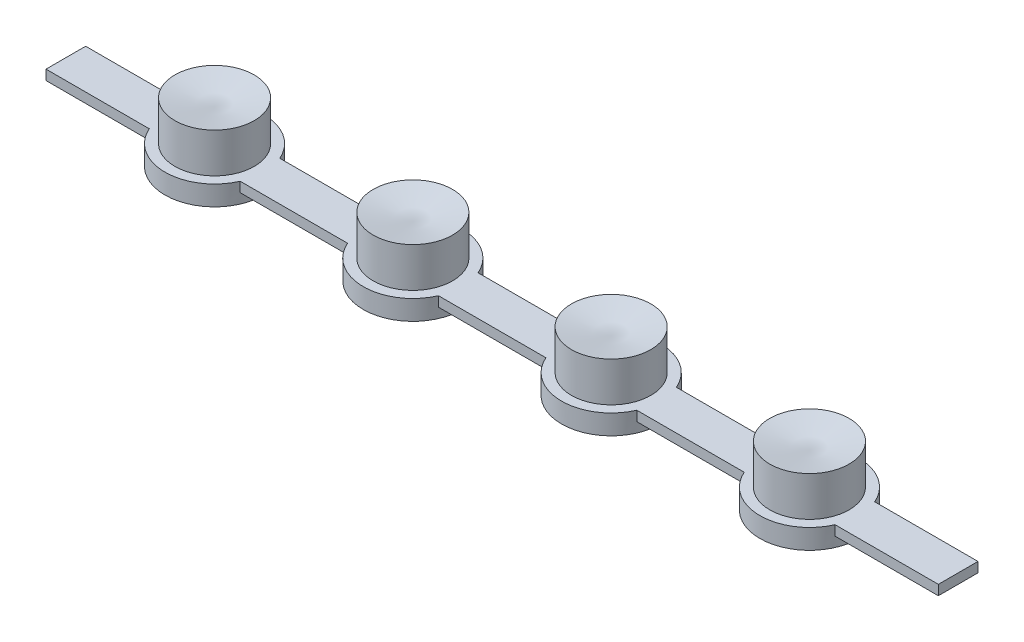
ISO-10303-21;
HEADER;
FILE_DESCRIPTION(('STEP AP214'),'2;1');
FILE_NAME('part.step','',(''),(''),'','','');
FILE_SCHEMA(('AUTOMOTIVE_DESIGN { 1 0 10303 214 1 1 1 1 }'));
ENDSEC;
DATA;
#1=APPLICATION_CONTEXT('core data for automotive mechanical design processes');
#2=APPLICATION_PROTOCOL_DEFINITION('international standard','automotive_design',2000,#1);
#3=PRODUCT_CONTEXT('',#1,'mechanical');
#4=PRODUCT('Part','Part','',(#3));
#5=PRODUCT_RELATED_PRODUCT_CATEGORY('part','',(#4));
#6=PRODUCT_DEFINITION_FORMATION('','',#4);
#7=PRODUCT_DEFINITION_CONTEXT('part definition',#1,'design');
#8=PRODUCT_DEFINITION('design','',#6,#7);
#9=PRODUCT_DEFINITION_SHAPE('','',#8);
#10=(LENGTH_UNIT() NAMED_UNIT(*) SI_UNIT(.MILLI.,.METRE.));
#11=(NAMED_UNIT(*) PLANE_ANGLE_UNIT() SI_UNIT($,.RADIAN.));
#12=(NAMED_UNIT(*) SI_UNIT($,.STERADIAN.) SOLID_ANGLE_UNIT());
#13=UNCERTAINTY_MEASURE_WITH_UNIT(LENGTH_MEASURE(1.E-05),#10,'distance_accuracy_value','');
#14=(GEOMETRIC_REPRESENTATION_CONTEXT(3) GLOBAL_UNCERTAINTY_ASSIGNED_CONTEXT((#13)) GLOBAL_UNIT_ASSIGNED_CONTEXT((#10,
#11,#12)) REPRESENTATION_CONTEXT('',''));
#15=CARTESIAN_POINT('',(0.,0.,0.));
#16=DIRECTION('',(0.,0.,1.));
#17=DIRECTION('',(1.,0.,0.));
#18=AXIS2_PLACEMENT_3D('',#15,#16,#17);
#19=CARTESIAN_POINT('',(0.,0.5,0.));
#20=DIRECTION('',(0.,-1.,0.));
#21=DIRECTION('',(0.,0.,-1.));
#22=AXIS2_PLACEMENT_3D('',#19,#20,#21);
#23=PLANE('',#22);
#24=DIRECTION('',(-1.,0.,0.));
#25=VECTOR('',#24,1.);
#26=CARTESIAN_POINT('',(-7.5,0.5,-0.999999999999999));
#27=LINE('',#26,#25);
#28=CARTESIAN_POINT('',(27.7087121525221,0.5,-0.999999999999999));
#29=VERTEX_POINT('',#28);
#30=CARTESIAN_POINT('',(22.2912878474779,0.5,-0.999999999999999));
#31=VERTEX_POINT('',#30);
#32=EDGE_CURVE('E272',#29,#31,#27,.T.);
#33=ORIENTED_EDGE('',*,*,#32,.F.);
#34=CARTESIAN_POINT('',(30.,0.5,0.));
#35=DIRECTION('',(0.,-1.,0.));
#36=DIRECTION('',(0.,0.,-1.));
#37=AXIS2_PLACEMENT_3D('',#34,#35,#36);
#38=CIRCLE('',#37,2.5);
#39=CARTESIAN_POINT('',(27.7087121525221,0.5,1.));
#40=VERTEX_POINT('',#39);
#41=EDGE_CURVE('E195',#29,#40,#38,.F.);
#42=ORIENTED_EDGE('',*,*,#41,.T.);
#43=DIRECTION('',(1.,0.,0.));
#44=VECTOR('',#43,1.);
#45=CARTESIAN_POINT('',(-7.5,0.5,1.));
#46=LINE('',#45,#44);
#47=CARTESIAN_POINT('',(22.2912878474779,0.5,1.));
#48=VERTEX_POINT('',#47);
#49=EDGE_CURVE('E466',#48,#40,#46,.T.);
#50=ORIENTED_EDGE('',*,*,#49,.F.);
#51=CARTESIAN_POINT('',(20.,0.5,0.));
#52=DIRECTION('',(0.,-1.,0.));
#53=DIRECTION('',(0.,0.,-1.));
#54=AXIS2_PLACEMENT_3D('',#51,#52,#53);
#55=CIRCLE('',#54,2.5);
#56=EDGE_CURVE('E225',#48,#31,#55,.F.);
#57=ORIENTED_EDGE('',*,*,#56,.T.);
#58=EDGE_LOOP('',(#33,#42,#50,#57));
#59=FACE_BOUND('',#58,.T.);
#60=ADVANCED_FACE('F33',(#59),#23,.T.);
#61=CARTESIAN_POINT('',(-7.5,0.5,1.));
#62=DIRECTION('',(0.,0.,1.));
#63=DIRECTION('',(1.,0.,0.));
#64=AXIS2_PLACEMENT_3D('',#61,#62,#63);
#65=PLANE('',#64);
#66=ORIENTED_EDGE('',*,*,#49,.T.);
#67=DIRECTION('',(0.,-1.,0.));
#68=VECTOR('',#67,1.);
#69=CARTESIAN_POINT('',(27.7087121525221,1.,1.));
#70=LINE('',#69,#68);
#71=CARTESIAN_POINT('',(27.7087121525221,1.,1.));
#72=VERTEX_POINT('',#71);
#73=EDGE_CURVE('E205',#40,#72,#70,.F.);
#74=ORIENTED_EDGE('',*,*,#73,.T.);
#75=DIRECTION('',(1.,0.,0.));
#76=VECTOR('',#75,1.);
#77=CARTESIAN_POINT('',(-7.5,1.,1.));
#78=LINE('',#77,#76);
#79=CARTESIAN_POINT('',(22.2912878474779,1.,1.));
#80=VERTEX_POINT('',#79);
#81=EDGE_CURVE('E436',#80,#72,#78,.T.);
#82=ORIENTED_EDGE('',*,*,#81,.F.);
#83=DIRECTION('',(0.,-1.,0.));
#84=VECTOR('',#83,1.);
#85=CARTESIAN_POINT('',(22.2912878474779,1.,1.));
#86=LINE('',#85,#84);
#87=EDGE_CURVE('E228',#80,#48,#86,.T.);
#88=ORIENTED_EDGE('',*,*,#87,.T.);
#89=EDGE_LOOP('',(#66,#74,#82,#88));
#90=FACE_BOUND('',#89,.T.);
#91=ADVANCED_FACE('F360',(#90),#65,.T.);
#92=CARTESIAN_POINT('',(-7.5,0.5,-0.999999999999999));
#93=DIRECTION('',(0.,0.,-1.));
#94=DIRECTION('',(-1.,0.,0.));
#95=AXIS2_PLACEMENT_3D('',#92,#93,#94);
#96=PLANE('',#95);
#97=DIRECTION('',(-1.,0.,0.));
#98=VECTOR('',#97,1.);
#99=CARTESIAN_POINT('',(-7.5,1.,-0.999999999999999));
#100=LINE('',#99,#98);
#101=CARTESIAN_POINT('',(27.7087121525221,1.,-0.999999999999999));
#102=VERTEX_POINT('',#101);
#103=CARTESIAN_POINT('',(22.2912878474779,1.,-0.999999999999999));
#104=VERTEX_POINT('',#103);
#105=EDGE_CURVE('E288',#102,#104,#100,.T.);
#106=ORIENTED_EDGE('',*,*,#105,.F.);
#107=DIRECTION('',(0.,-1.,0.));
#108=VECTOR('',#107,1.);
#109=CARTESIAN_POINT('',(27.7087121525221,1.,-0.999999999999999));
#110=LINE('',#109,#108);
#111=EDGE_CURVE('E191',#102,#29,#110,.T.);
#112=ORIENTED_EDGE('',*,*,#111,.T.);
#113=ORIENTED_EDGE('',*,*,#32,.T.);
#114=DIRECTION('',(0.,-1.,0.));
#115=VECTOR('',#114,1.);
#116=CARTESIAN_POINT('',(22.2912878474779,1.,-0.999999999999999));
#117=LINE('',#116,#115);
#118=EDGE_CURVE('E232',#31,#104,#117,.F.);
#119=ORIENTED_EDGE('',*,*,#118,.T.);
#120=EDGE_LOOP('',(#106,#112,#113,#119));
#121=FACE_BOUND('',#120,.T.);
#122=ADVANCED_FACE('F368',(#121),#96,.T.);
#123=CARTESIAN_POINT('',(17.7087121525221,1.,-0.999999999999999));
#124=VERTEX_POINT('',#123);
#125=CARTESIAN_POINT('',(12.2912878474779,1.,-0.999999999999999));
#126=VERTEX_POINT('',#125);
#127=EDGE_CURVE('E454',#124,#126,#100,.T.);
#128=ORIENTED_EDGE('',*,*,#127,.F.);
#129=DIRECTION('',(0.,-1.,0.));
#130=VECTOR('',#129,1.);
#131=CARTESIAN_POINT('',(17.7087121525221,1.,-0.999999999999999));
#132=LINE('',#131,#130);
#133=CARTESIAN_POINT('',(17.7087121525221,0.5,-0.999999999999999));
#134=VERTEX_POINT('',#133);
#135=EDGE_CURVE('E238',#124,#134,#132,.T.);
#136=ORIENTED_EDGE('',*,*,#135,.T.);
#137=CARTESIAN_POINT('',(12.2912878474779,0.5,-0.999999999999999));
#138=VERTEX_POINT('',#137);
#139=EDGE_CURVE('E419',#134,#138,#27,.T.);
#140=ORIENTED_EDGE('',*,*,#139,.T.);
#141=DIRECTION('',(0.,-1.,0.));
#142=VECTOR('',#141,1.);
#143=CARTESIAN_POINT('',(12.2912878474779,1.,-0.999999999999999));
#144=LINE('',#143,#142);
#145=EDGE_CURVE('E333',#138,#126,#144,.F.);
#146=ORIENTED_EDGE('',*,*,#145,.T.);
#147=EDGE_LOOP('',(#128,#136,#140,#146));
#148=FACE_BOUND('',#147,.T.);
#149=ADVANCED_FACE('F679',(#148),#96,.T.);
#150=CARTESIAN_POINT('',(12.2912878474779,0.5,1.));
#151=VERTEX_POINT('',#150);
#152=CARTESIAN_POINT('',(17.7087121525221,0.5,1.));
#153=VERTEX_POINT('',#152);
#154=EDGE_CURVE('E464',#151,#153,#46,.T.);
#155=ORIENTED_EDGE('',*,*,#154,.T.);
#156=DIRECTION('',(0.,-1.,0.));
#157=VECTOR('',#156,1.);
#158=CARTESIAN_POINT('',(17.7087121525221,1.,1.));
#159=LINE('',#158,#157);
#160=CARTESIAN_POINT('',(17.7087121525221,1.,1.));
#161=VERTEX_POINT('',#160);
#162=EDGE_CURVE('E235',#153,#161,#159,.F.);
#163=ORIENTED_EDGE('',*,*,#162,.T.);
#164=CARTESIAN_POINT('',(12.2912878474779,1.,1.));
#165=VERTEX_POINT('',#164);
#166=EDGE_CURVE('E435',#165,#161,#78,.T.);
#167=ORIENTED_EDGE('',*,*,#166,.F.);
#168=DIRECTION('',(0.,-1.,0.));
#169=VECTOR('',#168,1.);
#170=CARTESIAN_POINT('',(12.2912878474779,1.,1.));
#171=LINE('',#170,#169);
#172=EDGE_CURVE('E260',#165,#151,#171,.T.);
#173=ORIENTED_EDGE('',*,*,#172,.T.);
#174=EDGE_LOOP('',(#155,#163,#167,#173));
#175=FACE_BOUND('',#174,.T.);
#176=ADVANCED_FACE('F377',(#175),#65,.T.);
#177=ORIENTED_EDGE('',*,*,#139,.F.);
#178=EDGE_CURVE('E229',#134,#153,#55,.F.);
#179=ORIENTED_EDGE('',*,*,#178,.T.);
#180=ORIENTED_EDGE('',*,*,#154,.F.);
#181=CARTESIAN_POINT('',(10.,0.5,0.));
#182=DIRECTION('',(0.,-1.,0.));
#183=DIRECTION('',(0.,0.,-1.));
#184=AXIS2_PLACEMENT_3D('',#181,#182,#183);
#185=CIRCLE('',#184,2.5);
#186=EDGE_CURVE('E257',#151,#138,#185,.F.);
#187=ORIENTED_EDGE('',*,*,#186,.T.);
#188=EDGE_LOOP('',(#177,#179,#180,#187));
#189=FACE_BOUND('',#188,.T.);
#190=ADVANCED_FACE('F363',(#189),#23,.T.);
#191=CARTESIAN_POINT('',(7.70871215252208,0.5,-0.999999999999999));
#192=VERTEX_POINT('',#191);
#193=CARTESIAN_POINT('',(2.29128784747792,0.5,-0.999999999999999));
#194=VERTEX_POINT('',#193);
#195=EDGE_CURVE('E413',#192,#194,#27,.T.);
#196=ORIENTED_EDGE('',*,*,#195,.F.);
#197=CARTESIAN_POINT('',(7.70871215252208,0.5,1.));
#198=VERTEX_POINT('',#197);
#199=EDGE_CURVE('E250',#192,#198,#185,.F.);
#200=ORIENTED_EDGE('',*,*,#199,.T.);
#201=CARTESIAN_POINT('',(2.29128784747792,0.5,1.));
#202=VERTEX_POINT('',#201);
#203=EDGE_CURVE('E280',#202,#198,#46,.T.);
#204=ORIENTED_EDGE('',*,*,#203,.F.);
#205=CARTESIAN_POINT('',(0.,0.5,0.));
#206=DIRECTION('',(0.,-1.,0.));
#207=DIRECTION('',(0.,0.,-1.));
#208=AXIS2_PLACEMENT_3D('',#205,#206,#207);
#209=CIRCLE('',#208,2.5);
#210=EDGE_CURVE('E329',#194,#202,#209,.T.);
#211=ORIENTED_EDGE('',*,*,#210,.F.);
#212=EDGE_LOOP('',(#196,#200,#204,#211));
#213=FACE_BOUND('',#212,.T.);
#214=ADVANCED_FACE('F376',(#213),#23,.T.);
#215=ORIENTED_EDGE('',*,*,#203,.T.);
#216=DIRECTION('',(0.,-1.,0.));
#217=VECTOR('',#216,1.);
#218=CARTESIAN_POINT('',(7.70871215252208,1.,1.));
#219=LINE('',#218,#217);
#220=CARTESIAN_POINT('',(7.70871215252208,1.,1.));
#221=VERTEX_POINT('',#220);
#222=EDGE_CURVE('E256',#198,#221,#219,.F.);
#223=ORIENTED_EDGE('',*,*,#222,.T.);
#224=CARTESIAN_POINT('',(2.29128784747792,1.,1.));
#225=VERTEX_POINT('',#224);
#226=EDGE_CURVE('E292',#225,#221,#78,.T.);
#227=ORIENTED_EDGE('',*,*,#226,.F.);
#228=DIRECTION('',(0.,-1.,0.));
#229=VECTOR('',#228,1.);
#230=CARTESIAN_POINT('',(2.29128784747792,1.,1.));
#231=LINE('',#230,#229);
#232=EDGE_CURVE('E308',#202,#225,#231,.F.);
#233=ORIENTED_EDGE('',*,*,#232,.F.);
#234=EDGE_LOOP('',(#215,#223,#227,#233));
#235=FACE_BOUND('',#234,.T.);
#236=ADVANCED_FACE('F405',(#235),#65,.T.);
#237=CARTESIAN_POINT('',(7.70871215252208,1.,-0.999999999999999));
#238=VERTEX_POINT('',#237);
#239=CARTESIAN_POINT('',(2.29128784747792,1.,-0.999999999999999));
#240=VERTEX_POINT('',#239);
#241=EDGE_CURVE('E455',#238,#240,#100,.T.);
#242=ORIENTED_EDGE('',*,*,#241,.F.);
#243=DIRECTION('',(0.,-1.,0.));
#244=VECTOR('',#243,1.);
#245=CARTESIAN_POINT('',(7.70871215252208,1.,-0.999999999999999));
#246=LINE('',#245,#244);
#247=EDGE_CURVE('E330',#238,#192,#246,.T.);
#248=ORIENTED_EDGE('',*,*,#247,.T.);
#249=ORIENTED_EDGE('',*,*,#195,.T.);
#250=DIRECTION('',(0.,-1.,0.));
#251=VECTOR('',#250,1.);
#252=CARTESIAN_POINT('',(2.29128784747792,1.,-0.999999999999999));
#253=LINE('',#252,#251);
#254=EDGE_CURVE('E305',#240,#194,#253,.T.);
#255=ORIENTED_EDGE('',*,*,#254,.F.);
#256=EDGE_LOOP('',(#242,#248,#249,#255));
#257=FACE_BOUND('',#256,.T.);
#258=ADVANCED_FACE('F391',(#257),#96,.T.);
#259=CARTESIAN_POINT('',(0.,3.,0.));
#260=DIRECTION('',(0.,-1.,0.));
#261=DIRECTION('',(0.,0.,-1.));
#262=AXIS2_PLACEMENT_3D('',#259,#260,#261);
#263=CYLINDRICAL_SURFACE('',#262,2.);
#264=CARTESIAN_POINT('',(0.,1.,0.));
#265=DIRECTION('',(0.,1.,0.));
#266=DIRECTION('',(0.,0.,1.));
#267=AXIS2_PLACEMENT_3D('',#264,#265,#266);
#268=CIRCLE('',#267,2.);
#269=CARTESIAN_POINT('',(0.,1.,2.));
#270=VERTEX_POINT('',#269);
#271=EDGE_CURVE('E324',#270,#270,#268,.T.);
#272=ORIENTED_EDGE('',*,*,#271,.T.);
#273=EDGE_LOOP('',(#272));
#274=FACE_BOUND('',#273,.T.);
#275=CARTESIAN_POINT('',(0.,3.,0.));
#276=DIRECTION('',(0.,1.,0.));
#277=DIRECTION('',(0.,0.,1.));
#278=AXIS2_PLACEMENT_3D('',#275,#276,#277);
#279=CIRCLE('',#278,2.);
#280=CARTESIAN_POINT('',(0.,3.,2.));
#281=VERTEX_POINT('',#280);
#282=EDGE_CURVE('E320',#281,#281,#279,.T.);
#283=ORIENTED_EDGE('',*,*,#282,.F.);
#284=EDGE_LOOP('',(#283));
#285=FACE_BOUND('',#284,.T.);
#286=ADVANCED_FACE('F35',(#274,#285),#263,.T.);
#287=CARTESIAN_POINT('',(0.,3.,0.));
#288=DIRECTION('',(0.,1.,0.));
#289=DIRECTION('',(0.,0.,1.));
#290=AXIS2_PLACEMENT_3D('',#287,#288,#289);
#291=CONICAL_SURFACE('',#290,2.,1.37340076694502);
#292=CARTESIAN_POINT('',(0.,2.6,0.));
#293=VERTEX_POINT('',#292);
#294=VERTEX_LOOP('',#293);
#295=FACE_BOUND('',#294,.T.);
#296=ORIENTED_EDGE('',*,*,#282,.T.);
#297=EDGE_LOOP('',(#296));
#298=FACE_BOUND('',#297,.T.);
#299=ADVANCED_FACE('F499',(#295,#298),#291,.F.);
#300=CARTESIAN_POINT('',(0.,1.,0.));
#301=DIRECTION('',(0.,-1.,0.));
#302=DIRECTION('',(0.,0.,-1.));
#303=AXIS2_PLACEMENT_3D('',#300,#301,#302);
#304=CYLINDRICAL_SURFACE('',#303,2.5);
#305=ORIENTED_EDGE('',*,*,#210,.T.);
#306=ORIENTED_EDGE('',*,*,#232,.T.);
#307=CARTESIAN_POINT('',(0.,1.,0.));
#308=DIRECTION('',(0.,1.,0.));
#309=DIRECTION('',(0.,0.,1.));
#310=AXIS2_PLACEMENT_3D('',#307,#308,#309);
#311=CIRCLE('',#310,2.5);
#312=CARTESIAN_POINT('',(-2.29128784747792,1.,1.));
#313=VERTEX_POINT('',#312);
#314=EDGE_CURVE('E315',#313,#225,#311,.T.);
#315=ORIENTED_EDGE('',*,*,#314,.F.);
#316=DIRECTION('',(0.,-1.,0.));
#317=VECTOR('',#316,1.);
#318=CARTESIAN_POINT('',(-2.29128784747792,1.,1.));
#319=LINE('',#318,#317);
#320=CARTESIAN_POINT('',(-2.29128784747792,0.5,1.));
#321=VERTEX_POINT('',#320);
#322=EDGE_CURVE('E311',#313,#321,#319,.T.);
#323=ORIENTED_EDGE('',*,*,#322,.T.);
#324=CARTESIAN_POINT('',(-2.29128784747792,0.5,-0.999999999999999));
#325=VERTEX_POINT('',#324);
#326=EDGE_CURVE('E323',#321,#325,#209,.T.);
#327=ORIENTED_EDGE('',*,*,#326,.T.);
#328=DIRECTION('',(0.,-1.,0.));
#329=VECTOR('',#328,1.);
#330=CARTESIAN_POINT('',(-2.29128784747792,1.,-0.999999999999999));
#331=LINE('',#330,#329);
#332=CARTESIAN_POINT('',(-2.29128784747792,1.,-0.999999999999999));
#333=VERTEX_POINT('',#332);
#334=EDGE_CURVE('E296',#325,#333,#331,.F.);
#335=ORIENTED_EDGE('',*,*,#334,.T.);
#336=EDGE_CURVE('E317',#240,#333,#311,.T.);
#337=ORIENTED_EDGE('',*,*,#336,.F.);
#338=ORIENTED_EDGE('',*,*,#254,.T.);
#339=EDGE_LOOP('',(#305,#306,#315,#323,#327,#335,#337,#338));
#340=FACE_BOUND('',#339,.T.);
#341=CARTESIAN_POINT('',(0.,0.,0.));
#342=DIRECTION('',(0.,1.,0.));
#343=DIRECTION('',(0.,0.,1.));
#344=AXIS2_PLACEMENT_3D('',#341,#342,#343);
#345=CIRCLE('',#344,2.5);
#346=CARTESIAN_POINT('',(0.,0.,2.5));
#347=VERTEX_POINT('',#346);
#348=EDGE_CURVE('E314',#347,#347,#345,.T.);
#349=ORIENTED_EDGE('',*,*,#348,.T.);
#350=EDGE_LOOP('',(#349));
#351=FACE_BOUND('',#350,.T.);
#352=ADVANCED_FACE('F428',(#340,#351),#304,.T.);
#353=CARTESIAN_POINT('',(0.,0.,0.));
#354=DIRECTION('',(0.,1.,0.));
#355=DIRECTION('',(0.,0.,1.));
#356=AXIS2_PLACEMENT_3D('',#353,#354,#355);
#357=PLANE('',#356);
#358=ORIENTED_EDGE('',*,*,#348,.F.);
#359=EDGE_LOOP('',(#358));
#360=FACE_BOUND('',#359,.T.);
#361=ADVANCED_FACE('F392',(#360),#357,.F.);
#362=CARTESIAN_POINT('',(-7.5,0.5,1.));
#363=DIRECTION('',(-1.,0.,0.));
#364=DIRECTION('',(0.,0.,1.));
#365=AXIS2_PLACEMENT_3D('',#362,#363,#364);
#366=PLANE('',#365);
#367=DIRECTION('',(0.,0.,1.));
#368=VECTOR('',#367,1.);
#369=CARTESIAN_POINT('',(-7.5,1.,1.));
#370=LINE('',#369,#368);
#371=CARTESIAN_POINT('',(-7.5,1.,-0.999999999999999));
#372=VERTEX_POINT('',#371);
#373=CARTESIAN_POINT('',(-7.5,1.,1.));
#374=VERTEX_POINT('',#373);
#375=EDGE_CURVE('E287',#372,#374,#370,.T.);
#376=ORIENTED_EDGE('',*,*,#375,.F.);
#377=DIRECTION('',(0.,1.,0.));
#378=VECTOR('',#377,1.);
#379=CARTESIAN_POINT('',(-7.5,0.5,-0.999999999999999));
#380=LINE('',#379,#378);
#381=CARTESIAN_POINT('',(-7.5,0.5,-0.999999999999999));
#382=VERTEX_POINT('',#381);
#383=EDGE_CURVE('E299',#382,#372,#380,.T.);
#384=ORIENTED_EDGE('',*,*,#383,.F.);
#385=DIRECTION('',(0.,0.,1.));
#386=VECTOR('',#385,1.);
#387=CARTESIAN_POINT('',(-7.5,0.5,1.));
#388=LINE('',#387,#386);
#389=CARTESIAN_POINT('',(-7.5,0.5,1.));
#390=VERTEX_POINT('',#389);
#391=EDGE_CURVE('E271',#382,#390,#388,.T.);
#392=ORIENTED_EDGE('',*,*,#391,.T.);
#393=DIRECTION('',(0.,1.,0.));
#394=VECTOR('',#393,1.);
#395=CARTESIAN_POINT('',(-7.5,0.5,1.));
#396=LINE('',#395,#394);
#397=EDGE_CURVE('E297',#390,#374,#396,.T.);
#398=ORIENTED_EDGE('',*,*,#397,.T.);
#399=EDGE_LOOP('',(#376,#384,#392,#398));
#400=FACE_BOUND('',#399,.T.);
#401=ADVANCED_FACE('F381',(#400),#366,.T.);
#402=ORIENTED_EDGE('',*,*,#326,.F.);
#403=EDGE_CURVE('E276',#390,#321,#46,.T.);
#404=ORIENTED_EDGE('',*,*,#403,.F.);
#405=ORIENTED_EDGE('',*,*,#391,.F.);
#406=EDGE_CURVE('E267',#325,#382,#27,.T.);
#407=ORIENTED_EDGE('',*,*,#406,.F.);
#408=EDGE_LOOP('',(#402,#404,#405,#407));
#409=FACE_BOUND('',#408,.T.);
#410=ADVANCED_FACE('F364',(#409),#23,.T.);
#411=ORIENTED_EDGE('',*,*,#334,.F.);
#412=ORIENTED_EDGE('',*,*,#406,.T.);
#413=ORIENTED_EDGE('',*,*,#383,.T.);
#414=EDGE_CURVE('E283',#333,#372,#100,.T.);
#415=ORIENTED_EDGE('',*,*,#414,.F.);
#416=EDGE_LOOP('',(#411,#412,#413,#415));
#417=FACE_BOUND('',#416,.T.);
#418=ADVANCED_FACE('F380',(#417),#96,.T.);
#419=ORIENTED_EDGE('',*,*,#322,.F.);
#420=EDGE_CURVE('E55',#374,#313,#78,.T.);
#421=ORIENTED_EDGE('',*,*,#420,.F.);
#422=ORIENTED_EDGE('',*,*,#397,.F.);
#423=ORIENTED_EDGE('',*,*,#403,.T.);
#424=EDGE_LOOP('',(#419,#421,#422,#423));
#425=FACE_BOUND('',#424,.T.);
#426=ADVANCED_FACE('F372',(#425),#65,.T.);
#427=CARTESIAN_POINT('',(10.,3.,0.));
#428=DIRECTION('',(0.,-1.,0.));
#429=DIRECTION('',(0.,0.,-1.));
#430=AXIS2_PLACEMENT_3D('',#427,#428,#429);
#431=CYLINDRICAL_SURFACE('',#430,2.);
#432=CARTESIAN_POINT('',(10.,1.,0.));
#433=DIRECTION('',(0.,1.,0.));
#434=DIRECTION('',(0.,0.,1.));
#435=AXIS2_PLACEMENT_3D('',#432,#433,#434);
#436=CIRCLE('',#435,2.);
#437=CARTESIAN_POINT('',(10.,1.,2.));
#438=VERTEX_POINT('',#437);
#439=EDGE_CURVE('E251',#438,#438,#436,.T.);
#440=ORIENTED_EDGE('',*,*,#439,.T.);
#441=EDGE_LOOP('',(#440));
#442=FACE_BOUND('',#441,.T.);
#443=CARTESIAN_POINT('',(10.,3.,0.));
#444=DIRECTION('',(0.,1.,0.));
#445=DIRECTION('',(0.,0.,1.));
#446=AXIS2_PLACEMENT_3D('',#443,#444,#445);
#447=CIRCLE('',#446,2.);
#448=CARTESIAN_POINT('',(10.,3.,2.));
#449=VERTEX_POINT('',#448);
#450=EDGE_CURVE('E247',#449,#449,#447,.T.);
#451=ORIENTED_EDGE('',*,*,#450,.F.);
#452=EDGE_LOOP('',(#451));
#453=FACE_BOUND('',#452,.T.);
#454=ADVANCED_FACE('F543',(#442,#453),#431,.T.);
#455=CARTESIAN_POINT('',(10.,3.,0.));
#456=DIRECTION('',(0.,1.,0.));
#457=DIRECTION('',(0.,0.,1.));
#458=AXIS2_PLACEMENT_3D('',#455,#456,#457);
#459=CONICAL_SURFACE('',#458,2.,1.37340076694502);
#460=CARTESIAN_POINT('',(10.,2.6,0.));
#461=VERTEX_POINT('',#460);
#462=VERTEX_LOOP('',#461);
#463=FACE_BOUND('',#462,.T.);
#464=ORIENTED_EDGE('',*,*,#450,.T.);
#465=EDGE_LOOP('',(#464));
#466=FACE_BOUND('',#465,.T.);
#467=ADVANCED_FACE('F552',(#463,#466),#459,.F.);
#468=CARTESIAN_POINT('',(10.,1.,0.));
#469=DIRECTION('',(0.,-1.,0.));
#470=DIRECTION('',(0.,0.,-1.));
#471=AXIS2_PLACEMENT_3D('',#468,#469,#470);
#472=CYLINDRICAL_SURFACE('',#471,2.5);
#473=ORIENTED_EDGE('',*,*,#172,.F.);
#474=CARTESIAN_POINT('',(10.,1.,0.));
#475=DIRECTION('',(0.,1.,0.));
#476=DIRECTION('',(0.,0.,1.));
#477=AXIS2_PLACEMENT_3D('',#474,#475,#476);
#478=CIRCLE('',#477,2.5);
#479=EDGE_CURVE('E242',#221,#165,#478,.T.);
#480=ORIENTED_EDGE('',*,*,#479,.F.);
#481=ORIENTED_EDGE('',*,*,#222,.F.);
#482=ORIENTED_EDGE('',*,*,#199,.F.);
#483=ORIENTED_EDGE('',*,*,#247,.F.);
#484=EDGE_CURVE('E48',#126,#238,#478,.T.);
#485=ORIENTED_EDGE('',*,*,#484,.F.);
#486=ORIENTED_EDGE('',*,*,#145,.F.);
#487=ORIENTED_EDGE('',*,*,#186,.F.);
#488=EDGE_LOOP('',(#473,#480,#481,#482,#483,#485,#486,#487));
#489=FACE_BOUND('',#488,.T.);
#490=CARTESIAN_POINT('',(10.,0.,0.));
#491=DIRECTION('',(0.,1.,0.));
#492=DIRECTION('',(0.,0.,1.));
#493=AXIS2_PLACEMENT_3D('',#490,#491,#492);
#494=CIRCLE('',#493,2.5);
#495=CARTESIAN_POINT('',(10.,0.,2.5));
#496=VERTEX_POINT('',#495);
#497=EDGE_CURVE('E241',#496,#496,#494,.T.);
#498=ORIENTED_EDGE('',*,*,#497,.T.);
#499=EDGE_LOOP('',(#498));
#500=FACE_BOUND('',#499,.T.);
#501=ADVANCED_FACE('F461',(#489,#500),#472,.T.);
#502=CARTESIAN_POINT('',(10.,0.,0.));
#503=DIRECTION('',(0.,1.,0.));
#504=DIRECTION('',(0.,0.,1.));
#505=AXIS2_PLACEMENT_3D('',#502,#503,#504);
#506=PLANE('',#505);
#507=ORIENTED_EDGE('',*,*,#497,.F.);
#508=EDGE_LOOP('',(#507));
#509=FACE_BOUND('',#508,.T.);
#510=ADVANCED_FACE('F344',(#509),#506,.F.);
#511=CARTESIAN_POINT('',(20.,3.,0.));
#512=DIRECTION('',(0.,-1.,0.));
#513=DIRECTION('',(0.,0.,-1.));
#514=AXIS2_PLACEMENT_3D('',#511,#512,#513);
#515=CYLINDRICAL_SURFACE('',#514,2.);
#516=CARTESIAN_POINT('',(20.,1.,0.));
#517=DIRECTION('',(0.,1.,0.));
#518=DIRECTION('',(0.,0.,1.));
#519=AXIS2_PLACEMENT_3D('',#516,#517,#518);
#520=CIRCLE('',#519,2.);
#521=CARTESIAN_POINT('',(20.,1.,2.));
#522=VERTEX_POINT('',#521);
#523=EDGE_CURVE('E41',#522,#522,#520,.F.);
#524=ORIENTED_EDGE('',*,*,#523,.F.);
#525=EDGE_LOOP('',(#524));
#526=FACE_BOUND('',#525,.T.);
#527=CARTESIAN_POINT('',(20.,3.,0.));
#528=DIRECTION('',(0.,1.,0.));
#529=DIRECTION('',(0.,0.,1.));
#530=AXIS2_PLACEMENT_3D('',#527,#528,#529);
#531=CIRCLE('',#530,2.);
#532=CARTESIAN_POINT('',(20.,3.,2.));
#533=VERTEX_POINT('',#532);
#534=EDGE_CURVE('E222',#533,#533,#531,.T.);
#535=ORIENTED_EDGE('',*,*,#534,.F.);
#536=EDGE_LOOP('',(#535));
#537=FACE_BOUND('',#536,.T.);
#538=ADVANCED_FACE('F340',(#526,#537),#515,.T.);
#539=CARTESIAN_POINT('',(20.,3.,0.));
#540=DIRECTION('',(0.,1.,0.));
#541=DIRECTION('',(0.,0.,1.));
#542=AXIS2_PLACEMENT_3D('',#539,#540,#541);
#543=CONICAL_SURFACE('',#542,2.,1.37340076694502);
#544=CARTESIAN_POINT('',(20.,2.6,0.));
#545=VERTEX_POINT('',#544);
#546=VERTEX_LOOP('',#545);
#547=FACE_BOUND('',#546,.T.);
#548=ORIENTED_EDGE('',*,*,#534,.T.);
#549=EDGE_LOOP('',(#548));
#550=FACE_BOUND('',#549,.T.);
#551=ADVANCED_FACE('F343',(#547,#550),#543,.F.);
#552=CARTESIAN_POINT('',(20.,1.,0.));
#553=DIRECTION('',(0.,-1.,0.));
#554=DIRECTION('',(0.,0.,-1.));
#555=AXIS2_PLACEMENT_3D('',#552,#553,#554);
#556=CYLINDRICAL_SURFACE('',#555,2.5);
#557=ORIENTED_EDGE('',*,*,#135,.F.);
#558=CARTESIAN_POINT('',(20.,1.,0.));
#559=DIRECTION('',(0.,1.,0.));
#560=DIRECTION('',(0.,0.,1.));
#561=AXIS2_PLACEMENT_3D('',#558,#559,#560);
#562=CIRCLE('',#561,2.5);
#563=EDGE_CURVE('E219',#104,#124,#562,.T.);
#564=ORIENTED_EDGE('',*,*,#563,.F.);
#565=ORIENTED_EDGE('',*,*,#118,.F.);
#566=ORIENTED_EDGE('',*,*,#56,.F.);
#567=ORIENTED_EDGE('',*,*,#87,.F.);
#568=EDGE_CURVE('E216',#161,#80,#562,.T.);
#569=ORIENTED_EDGE('',*,*,#568,.F.);
#570=ORIENTED_EDGE('',*,*,#162,.F.);
#571=ORIENTED_EDGE('',*,*,#178,.F.);
#572=EDGE_LOOP('',(#557,#564,#565,#566,#567,#569,#570,#571));
#573=FACE_BOUND('',#572,.T.);
#574=CARTESIAN_POINT('',(20.,0.,0.));
#575=DIRECTION('',(0.,1.,0.));
#576=DIRECTION('',(0.,0.,1.));
#577=AXIS2_PLACEMENT_3D('',#574,#575,#576);
#578=CIRCLE('',#577,2.5);
#579=CARTESIAN_POINT('',(20.,0.,2.5));
#580=VERTEX_POINT('',#579);
#581=EDGE_CURVE('E215',#580,#580,#578,.T.);
#582=ORIENTED_EDGE('',*,*,#581,.T.);
#583=EDGE_LOOP('',(#582));
#584=FACE_BOUND('',#583,.T.);
#585=ADVANCED_FACE('F349',(#573,#584),#556,.T.);
#586=CARTESIAN_POINT('',(20.,0.,0.));
#587=DIRECTION('',(0.,1.,0.));
#588=DIRECTION('',(0.,0.,1.));
#589=AXIS2_PLACEMENT_3D('',#586,#587,#588);
#590=PLANE('',#589);
#591=ORIENTED_EDGE('',*,*,#581,.F.);
#592=EDGE_LOOP('',(#591));
#593=FACE_BOUND('',#592,.T.);
#594=ADVANCED_FACE('F355',(#593),#590,.F.);
#595=CARTESIAN_POINT('',(30.,3.,0.));
#596=DIRECTION('',(0.,-1.,0.));
#597=DIRECTION('',(0.,0.,-1.));
#598=AXIS2_PLACEMENT_3D('',#595,#596,#597);
#599=CYLINDRICAL_SURFACE('',#598,2.);
#600=CARTESIAN_POINT('',(30.,1.,0.));
#601=DIRECTION('',(0.,1.,0.));
#602=DIRECTION('',(0.,0.,1.));
#603=AXIS2_PLACEMENT_3D('',#600,#601,#602);
#604=CIRCLE('',#603,2.);
#605=CARTESIAN_POINT('',(30.,1.,2.));
#606=VERTEX_POINT('',#605);
#607=EDGE_CURVE('E11',#606,#606,#604,.F.);
#608=ORIENTED_EDGE('',*,*,#607,.F.);
#609=EDGE_LOOP('',(#608));
#610=FACE_BOUND('',#609,.T.);
#611=CARTESIAN_POINT('',(30.,3.,0.));
#612=DIRECTION('',(0.,1.,0.));
#613=DIRECTION('',(0.,0.,1.));
#614=AXIS2_PLACEMENT_3D('',#611,#612,#613);
#615=CIRCLE('',#614,2.);
#616=CARTESIAN_POINT('',(30.,3.,2.));
#617=VERTEX_POINT('',#616);
#618=EDGE_CURVE('E189',#617,#617,#615,.T.);
#619=ORIENTED_EDGE('',*,*,#618,.F.);
#620=EDGE_LOOP('',(#619));
#621=FACE_BOUND('',#620,.T.);
#622=ADVANCED_FACE('F185',(#610,#621),#599,.T.);
#623=CARTESIAN_POINT('',(30.,3.,0.));
#624=DIRECTION('',(0.,1.,0.));
#625=DIRECTION('',(0.,0.,1.));
#626=AXIS2_PLACEMENT_3D('',#623,#624,#625);
#627=CONICAL_SURFACE('',#626,2.,1.37340076694502);
#628=CARTESIAN_POINT('',(30.,2.6,0.));
#629=VERTEX_POINT('',#628);
#630=VERTEX_LOOP('',#629);
#631=FACE_BOUND('',#630,.T.);
#632=ORIENTED_EDGE('',*,*,#618,.T.);
#633=EDGE_LOOP('',(#632));
#634=FACE_BOUND('',#633,.T.);
#635=ADVANCED_FACE('F181',(#631,#634),#627,.F.);
#636=CARTESIAN_POINT('',(30.,1.,0.));
#637=DIRECTION('',(0.,-1.,0.));
#638=DIRECTION('',(0.,0.,-1.));
#639=AXIS2_PLACEMENT_3D('',#636,#637,#638);
#640=CYLINDRICAL_SURFACE('',#639,2.5);
#641=DIRECTION('',(0.,-1.,0.));
#642=VECTOR('',#641,1.);
#643=CARTESIAN_POINT('',(32.2912878474779,1.,1.));
#644=LINE('',#643,#642);
#645=CARTESIAN_POINT('',(32.2912878474779,1.,1.));
#646=VERTEX_POINT('',#645);
#647=CARTESIAN_POINT('',(32.2912878474779,0.5,1.));
#648=VERTEX_POINT('',#647);
#649=EDGE_CURVE('E212',#646,#648,#644,.T.);
#650=ORIENTED_EDGE('',*,*,#649,.F.);
#651=CARTESIAN_POINT('',(30.,1.,0.));
#652=DIRECTION('',(0.,1.,0.));
#653=DIRECTION('',(0.,0.,1.));
#654=AXIS2_PLACEMENT_3D('',#651,#652,#653);
#655=CIRCLE('',#654,2.5);
#656=EDGE_CURVE('E198',#72,#646,#655,.T.);
#657=ORIENTED_EDGE('',*,*,#656,.F.);
#658=ORIENTED_EDGE('',*,*,#73,.F.);
#659=ORIENTED_EDGE('',*,*,#41,.F.);
#660=ORIENTED_EDGE('',*,*,#111,.F.);
#661=CARTESIAN_POINT('',(32.2912878474779,1.,-1.));
#662=VERTEX_POINT('',#661);
#663=EDGE_CURVE('E192',#662,#102,#655,.T.);
#664=ORIENTED_EDGE('',*,*,#663,.F.);
#665=DIRECTION('',(0.,-1.,0.));
#666=VECTOR('',#665,1.);
#667=CARTESIAN_POINT('',(32.2912878474779,1.,-0.999999999999999));
#668=LINE('',#667,#666);
#669=CARTESIAN_POINT('',(32.2912878474779,0.5,-0.999999999999999));
#670=VERTEX_POINT('',#669);
#671=EDGE_CURVE('E209',#670,#662,#668,.F.);
#672=ORIENTED_EDGE('',*,*,#671,.F.);
#673=EDGE_CURVE('E206',#648,#670,#38,.F.);
#674=ORIENTED_EDGE('',*,*,#673,.F.);
#675=EDGE_LOOP('',(#650,#657,#658,#659,#660,#664,#672,#674));
#676=FACE_BOUND('',#675,.T.);
#677=CARTESIAN_POINT('',(30.,0.,0.));
#678=DIRECTION('',(0.,1.,0.));
#679=DIRECTION('',(0.,0.,1.));
#680=AXIS2_PLACEMENT_3D('',#677,#678,#679);
#681=CIRCLE('',#680,2.5);
#682=CARTESIAN_POINT('',(30.,0.,2.5));
#683=VERTEX_POINT('',#682);
#684=EDGE_CURVE('E201',#683,#683,#681,.T.);
#685=ORIENTED_EDGE('',*,*,#684,.T.);
#686=EDGE_LOOP('',(#685));
#687=FACE_BOUND('',#686,.T.);
#688=ADVANCED_FACE('F184',(#676,#687),#640,.T.);
#689=CARTESIAN_POINT('',(30.,0.,0.));
#690=DIRECTION('',(0.,1.,0.));
#691=DIRECTION('',(0.,0.,1.));
#692=AXIS2_PLACEMENT_3D('',#689,#690,#691);
#693=PLANE('',#692);
#694=ORIENTED_EDGE('',*,*,#684,.F.);
#695=EDGE_LOOP('',(#694));
#696=FACE_BOUND('',#695,.T.);
#697=ADVANCED_FACE('F475',(#696),#693,.F.);
#698=CARTESIAN_POINT('',(37.5,0.5,1.));
#699=DIRECTION('',(1.,0.,0.));
#700=DIRECTION('',(0.,0.,-1.));
#701=AXIS2_PLACEMENT_3D('',#698,#699,#700);
#702=PLANE('',#701);
#703=DIRECTION('',(0.,0.,-1.));
#704=VECTOR('',#703,1.);
#705=CARTESIAN_POINT('',(37.5,1.,1.));
#706=LINE('',#705,#704);
#707=CARTESIAN_POINT('',(37.5,1.,1.));
#708=VERTEX_POINT('',#707);
#709=CARTESIAN_POINT('',(37.5,1.,-0.999999999999999));
#710=VERTEX_POINT('',#709);
#711=EDGE_CURVE('E263',#708,#710,#706,.T.);
#712=ORIENTED_EDGE('',*,*,#711,.F.);
#713=DIRECTION('',(0.,1.,0.));
#714=VECTOR('',#713,1.);
#715=CARTESIAN_POINT('',(37.5,0.5,1.));
#716=LINE('',#715,#714);
#717=CARTESIAN_POINT('',(37.5,0.5,1.));
#718=VERTEX_POINT('',#717);
#719=EDGE_CURVE('E293',#718,#708,#716,.T.);
#720=ORIENTED_EDGE('',*,*,#719,.F.);
#721=DIRECTION('',(0.,0.,-1.));
#722=VECTOR('',#721,1.);
#723=CARTESIAN_POINT('',(37.5,0.5,1.));
#724=LINE('',#723,#722);
#725=CARTESIAN_POINT('',(37.5,0.5,-0.999999999999999));
#726=VERTEX_POINT('',#725);
#727=EDGE_CURVE('E264',#718,#726,#724,.T.);
#728=ORIENTED_EDGE('',*,*,#727,.T.);
#729=DIRECTION('',(0.,1.,0.));
#730=VECTOR('',#729,1.);
#731=CARTESIAN_POINT('',(37.5,0.5,-0.999999999999999));
#732=LINE('',#731,#730);
#733=EDGE_CURVE('E279',#726,#710,#732,.T.);
#734=ORIENTED_EDGE('',*,*,#733,.T.);
#735=EDGE_LOOP('',(#712,#720,#728,#734));
#736=FACE_BOUND('',#735,.T.);
#737=ADVANCED_FACE('F444',(#736),#702,.T.);
#738=EDGE_CURVE('E268',#726,#670,#27,.T.);
#739=ORIENTED_EDGE('',*,*,#738,.T.);
#740=ORIENTED_EDGE('',*,*,#671,.T.);
#741=EDGE_CURVE('E284',#710,#662,#100,.T.);
#742=ORIENTED_EDGE('',*,*,#741,.F.);
#743=ORIENTED_EDGE('',*,*,#733,.F.);
#744=EDGE_LOOP('',(#739,#740,#742,#743));
#745=FACE_BOUND('',#744,.T.);
#746=ADVANCED_FACE('F390',(#745),#96,.T.);
#747=EDGE_CURVE('E290',#646,#708,#78,.T.);
#748=ORIENTED_EDGE('',*,*,#747,.F.);
#749=ORIENTED_EDGE('',*,*,#649,.T.);
#750=EDGE_CURVE('E275',#648,#718,#46,.T.);
#751=ORIENTED_EDGE('',*,*,#750,.T.);
#752=ORIENTED_EDGE('',*,*,#719,.T.);
#753=EDGE_LOOP('',(#748,#749,#751,#752));
#754=FACE_BOUND('',#753,.T.);
#755=ADVANCED_FACE('F371',(#754),#65,.T.);
#756=ORIENTED_EDGE('',*,*,#750,.F.);
#757=ORIENTED_EDGE('',*,*,#673,.T.);
#758=ORIENTED_EDGE('',*,*,#738,.F.);
#759=ORIENTED_EDGE('',*,*,#727,.F.);
#760=EDGE_LOOP('',(#756,#757,#758,#759));
#761=FACE_BOUND('',#760,.T.);
#762=ADVANCED_FACE('F383',(#761),#23,.T.);
#763=CARTESIAN_POINT('',(0.,1.,0.));
#764=DIRECTION('',(0.,1.,0.));
#765=DIRECTION('',(0.,0.,1.));
#766=AXIS2_PLACEMENT_3D('',#763,#764,#765);
#767=PLANE('',#766);
#768=ORIENTED_EDGE('',*,*,#656,.T.);
#769=ORIENTED_EDGE('',*,*,#747,.T.);
#770=ORIENTED_EDGE('',*,*,#711,.T.);
#771=ORIENTED_EDGE('',*,*,#741,.T.);
#772=ORIENTED_EDGE('',*,*,#663,.T.);
#773=ORIENTED_EDGE('',*,*,#105,.T.);
#774=ORIENTED_EDGE('',*,*,#563,.T.);
#775=ORIENTED_EDGE('',*,*,#127,.T.);
#776=ORIENTED_EDGE('',*,*,#484,.T.);
#777=ORIENTED_EDGE('',*,*,#241,.T.);
#778=ORIENTED_EDGE('',*,*,#336,.T.);
#779=ORIENTED_EDGE('',*,*,#414,.T.);
#780=ORIENTED_EDGE('',*,*,#375,.T.);
#781=ORIENTED_EDGE('',*,*,#420,.T.);
#782=ORIENTED_EDGE('',*,*,#314,.T.);
#783=ORIENTED_EDGE('',*,*,#226,.T.);
#784=ORIENTED_EDGE('',*,*,#479,.T.);
#785=ORIENTED_EDGE('',*,*,#166,.T.);
#786=ORIENTED_EDGE('',*,*,#568,.T.);
#787=ORIENTED_EDGE('',*,*,#81,.T.);
#788=EDGE_LOOP('',(#768,#769,#770,#771,#772,#773,#774,#775,#776,#777,#778,#779,#780,#781,#782,
#783,#784,#785,#786,#787));
#789=FACE_BOUND('',#788,.T.);
#790=ORIENTED_EDGE('',*,*,#607,.T.);
#791=EDGE_LOOP('',(#790));
#792=FACE_BOUND('',#791,.T.);
#793=ORIENTED_EDGE('',*,*,#439,.F.);
#794=EDGE_LOOP('',(#793));
#795=FACE_BOUND('',#794,.T.);
#796=ORIENTED_EDGE('',*,*,#271,.F.);
#797=EDGE_LOOP('',(#796));
#798=FACE_BOUND('',#797,.T.);
#799=ORIENTED_EDGE('',*,*,#523,.T.);
#800=EDGE_LOOP('',(#799));
#801=FACE_BOUND('',#800,.T.);
#802=ADVANCED_FACE('F338',(#789,#792,#795,#798,#801),#767,.T.);
#803=CLOSED_SHELL('',(#60,#91,#122,#149,#176,#190,#214,#236,#258,#286,#299,#352,#361,#401,#410,
#418,#426,#454,#467,#501,#510,#538,#551,#585,#594,#622,#635,#688,#697,#737,#746,#755,#762,#802));
#804=MANIFOLD_SOLID_BREP('B2',#803);
#805=ADVANCED_BREP_SHAPE_REPRESENTATION('',(#18,#804),#14);
#806=SHAPE_DEFINITION_REPRESENTATION(#9,#805);
ENDSEC;
END-ISO-10303-21;
